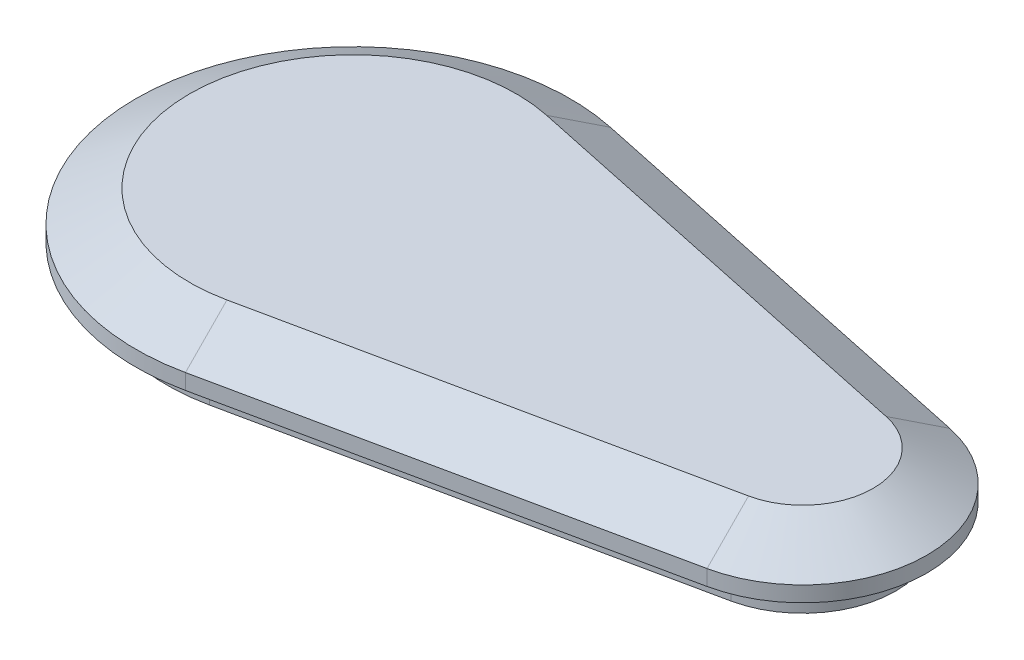
ISO-10303-21;
HEADER;
FILE_DESCRIPTION(('STEP AP214'),'2;1');
FILE_NAME('part.step','',(''),(''),'','','');
FILE_SCHEMA(('AUTOMOTIVE_DESIGN { 1 0 10303 214 1 1 1 1 }'));
ENDSEC;
DATA;
#1=APPLICATION_CONTEXT('core data for automotive mechanical design processes');
#2=APPLICATION_PROTOCOL_DEFINITION('international standard','automotive_design',2000,#1);
#3=PRODUCT_CONTEXT('',#1,'mechanical');
#4=PRODUCT('Part','Part','',(#3));
#5=PRODUCT_RELATED_PRODUCT_CATEGORY('part','',(#4));
#6=PRODUCT_DEFINITION_FORMATION('','',#4);
#7=PRODUCT_DEFINITION_CONTEXT('part definition',#1,'design');
#8=PRODUCT_DEFINITION('design','',#6,#7);
#9=PRODUCT_DEFINITION_SHAPE('','',#8);
#10=(LENGTH_UNIT() NAMED_UNIT(*) SI_UNIT(.MILLI.,.METRE.));
#11=(NAMED_UNIT(*) PLANE_ANGLE_UNIT() SI_UNIT($,.RADIAN.));
#12=(NAMED_UNIT(*) SI_UNIT($,.STERADIAN.) SOLID_ANGLE_UNIT());
#13=UNCERTAINTY_MEASURE_WITH_UNIT(LENGTH_MEASURE(1.E-05),#10,'distance_accuracy_value','');
#14=(GEOMETRIC_REPRESENTATION_CONTEXT(3) GLOBAL_UNCERTAINTY_ASSIGNED_CONTEXT((#13)) GLOBAL_UNIT_ASSIGNED_CONTEXT((#10,
#11,#12)) REPRESENTATION_CONTEXT('',''));
#15=CARTESIAN_POINT('',(0.,0.,0.));
#16=DIRECTION('',(0.,0.,1.));
#17=DIRECTION('',(1.,0.,0.));
#18=AXIS2_PLACEMENT_3D('',#15,#16,#17);
#19=CARTESIAN_POINT('',(0.,2.,0.));
#20=DIRECTION('',(0.,-1.,0.));
#21=DIRECTION('',(0.,0.,-1.));
#22=AXIS2_PLACEMENT_3D('',#19,#20,#21);
#23=CYLINDRICAL_SURFACE('',#22,12.);
#24=CARTESIAN_POINT('',(0.,0.,0.));
#25=DIRECTION('',(0.,1.,0.));
#26=DIRECTION('',(0.,0.,1.));
#27=AXIS2_PLACEMENT_3D('',#24,#25,#26);
#28=CIRCLE('',#27,12.);
#29=CARTESIAN_POINT('',(2.48275862068966,0.,-11.7403538971954));
#30=VERTEX_POINT('',#29);
#31=CARTESIAN_POINT('',(2.48275862068965,0.,11.7403538971954));
#32=VERTEX_POINT('',#31);
#33=EDGE_CURVE('E189',#30,#32,#28,.T.);
#34=ORIENTED_EDGE('',*,*,#33,.T.);
#35=DIRECTION('',(0.,-1.,0.));
#36=VECTOR('',#35,1.);
#37=CARTESIAN_POINT('',(2.48275862068965,2.,11.7403538971954));
#38=LINE('',#37,#36);
#39=CARTESIAN_POINT('',(2.48275862068965,2.,11.7403538971954));
#40=VERTEX_POINT('',#39);
#41=EDGE_CURVE('E11',#40,#32,#38,.T.);
#42=ORIENTED_EDGE('',*,*,#41,.F.);
#43=CARTESIAN_POINT('',(0.,2.,0.));
#44=DIRECTION('',(0.,1.,0.));
#45=DIRECTION('',(0.,0.,1.));
#46=AXIS2_PLACEMENT_3D('',#43,#44,#45);
#47=CIRCLE('',#46,12.);
#48=CARTESIAN_POINT('',(2.48275862068966,2.,-11.7403538971954));
#49=VERTEX_POINT('',#48);
#50=EDGE_CURVE('E190',#49,#40,#47,.T.);
#51=ORIENTED_EDGE('',*,*,#50,.F.);
#52=DIRECTION('',(0.,-1.,0.));
#53=VECTOR('',#52,1.);
#54=CARTESIAN_POINT('',(2.48275862068966,2.,-11.7403538971954));
#55=LINE('',#54,#53);
#56=EDGE_CURVE('E200',#49,#30,#55,.T.);
#57=ORIENTED_EDGE('',*,*,#56,.T.);
#58=EDGE_LOOP('',(#34,#42,#51,#57));
#59=FACE_BOUND('',#58,.T.);
#60=ADVANCED_FACE('F34',(#59),#23,.T.);
#61=CARTESIAN_POINT('',(2.48275862068965,2.,11.7403538971954));
#62=DIRECTION('',(-0.206896551724138,0.,-0.978362824766283));
#63=DIRECTION('',(-0.978362824766283,0.,0.206896551724138));
#64=AXIS2_PLACEMENT_3D('',#61,#62,#63);
#65=PLANE('',#64);
#66=DIRECTION('',(0.978362824766283,0.,-0.206896551724138));
#67=VECTOR('',#66,1.);
#68=CARTESIAN_POINT('',(2.48275862068965,0.,11.7403538971954));
#69=LINE('',#68,#67);
#70=CARTESIAN_POINT('',(30.2413793103448,0.,5.8701769485977));
#71=VERTEX_POINT('',#70);
#72=EDGE_CURVE('E203',#32,#71,#69,.T.);
#73=ORIENTED_EDGE('',*,*,#72,.T.);
#74=DIRECTION('',(0.,-1.,0.));
#75=VECTOR('',#74,1.);
#76=CARTESIAN_POINT('',(30.2413793103448,2.,5.8701769485977));
#77=LINE('',#76,#75);
#78=CARTESIAN_POINT('',(30.2413793103448,2.,5.8701769485977));
#79=VERTEX_POINT('',#78);
#80=EDGE_CURVE('E42',#79,#71,#77,.T.);
#81=ORIENTED_EDGE('',*,*,#80,.F.);
#82=DIRECTION('',(0.978362824766283,0.,-0.206896551724138));
#83=VECTOR('',#82,1.);
#84=CARTESIAN_POINT('',(2.48275862068965,2.,11.7403538971954));
#85=LINE('',#84,#83);
#86=EDGE_CURVE('E76',#40,#79,#85,.T.);
#87=ORIENTED_EDGE('',*,*,#86,.F.);
#88=ORIENTED_EDGE('',*,*,#41,.T.);
#89=EDGE_LOOP('',(#73,#81,#87,#88));
#90=FACE_BOUND('',#89,.T.);
#91=ADVANCED_FACE('F229',(#90),#65,.F.);
#92=CARTESIAN_POINT('',(29.,2.,0.));
#93=DIRECTION('',(0.,-1.,0.));
#94=DIRECTION('',(0.,0.,-1.));
#95=AXIS2_PLACEMENT_3D('',#92,#93,#94);
#96=CYLINDRICAL_SURFACE('',#95,6.);
#97=CARTESIAN_POINT('',(29.,0.,0.));
#98=DIRECTION('',(0.,1.,0.));
#99=DIRECTION('',(0.,0.,1.));
#100=AXIS2_PLACEMENT_3D('',#97,#98,#99);
#101=CIRCLE('',#100,6.);
#102=CARTESIAN_POINT('',(30.2413793103448,0.,-5.8701769485977));
#103=VERTEX_POINT('',#102);
#104=EDGE_CURVE('E66',#71,#103,#101,.T.);
#105=ORIENTED_EDGE('',*,*,#104,.T.);
#106=DIRECTION('',(0.,-1.,0.));
#107=VECTOR('',#106,1.);
#108=CARTESIAN_POINT('',(30.2413793103448,2.,-5.8701769485977));
#109=LINE('',#108,#107);
#110=CARTESIAN_POINT('',(30.2413793103448,2.,-5.8701769485977));
#111=VERTEX_POINT('',#110);
#112=EDGE_CURVE('E50',#111,#103,#109,.T.);
#113=ORIENTED_EDGE('',*,*,#112,.F.);
#114=CARTESIAN_POINT('',(29.,2.,0.));
#115=DIRECTION('',(0.,1.,0.));
#116=DIRECTION('',(0.,0.,1.));
#117=AXIS2_PLACEMENT_3D('',#114,#115,#116);
#118=CIRCLE('',#117,6.);
#119=EDGE_CURVE('E194',#79,#111,#118,.T.);
#120=ORIENTED_EDGE('',*,*,#119,.F.);
#121=ORIENTED_EDGE('',*,*,#80,.T.);
#122=EDGE_LOOP('',(#105,#113,#120,#121));
#123=FACE_BOUND('',#122,.T.);
#124=ADVANCED_FACE('F208',(#123),#96,.T.);
#125=CARTESIAN_POINT('',(2.48275862068966,2.,-11.7403538971954));
#126=DIRECTION('',(-0.206896551724138,0.,0.978362824766283));
#127=DIRECTION('',(0.978362824766283,0.,0.206896551724138));
#128=AXIS2_PLACEMENT_3D('',#125,#126,#127);
#129=PLANE('',#128);
#130=DIRECTION('',(-0.978362824766283,0.,-0.206896551724138));
#131=VECTOR('',#130,1.);
#132=CARTESIAN_POINT('',(2.48275862068966,0.,-11.7403538971954));
#133=LINE('',#132,#131);
#134=EDGE_CURVE('E71',#103,#30,#133,.T.);
#135=ORIENTED_EDGE('',*,*,#134,.T.);
#136=ORIENTED_EDGE('',*,*,#56,.F.);
#137=DIRECTION('',(-0.978362824766283,0.,-0.206896551724138));
#138=VECTOR('',#137,1.);
#139=CARTESIAN_POINT('',(2.48275862068966,2.,-11.7403538971954));
#140=LINE('',#139,#138);
#141=EDGE_CURVE('E197',#111,#49,#140,.T.);
#142=ORIENTED_EDGE('',*,*,#141,.F.);
#143=ORIENTED_EDGE('',*,*,#112,.T.);
#144=EDGE_LOOP('',(#135,#136,#142,#143));
#145=FACE_BOUND('',#144,.T.);
#146=ADVANCED_FACE('F213',(#145),#129,.F.);
#147=CARTESIAN_POINT('',(0.,0.,0.));
#148=DIRECTION('',(0.,1.,0.));
#149=DIRECTION('',(0.,0.,1.));
#150=AXIS2_PLACEMENT_3D('',#147,#148,#149);
#151=PLANE('',#150);
#152=ORIENTED_EDGE('',*,*,#33,.F.);
#153=ORIENTED_EDGE('',*,*,#134,.F.);
#154=ORIENTED_EDGE('',*,*,#104,.F.);
#155=ORIENTED_EDGE('',*,*,#72,.F.);
#156=EDGE_LOOP('',(#152,#153,#154,#155));
#157=FACE_BOUND('',#156,.T.);
#158=ADVANCED_FACE('F211',(#157),#151,.F.);
#159=CARTESIAN_POINT('',(29.,2.,0.));
#160=DIRECTION('',(0.,1.,0.));
#161=DIRECTION('',(0.,0.,1.));
#162=AXIS2_PLACEMENT_3D('',#159,#160,#161);
#163=PLANE('',#162);
#164=CARTESIAN_POINT('',(29.,2.,0.));
#165=DIRECTION('',(0.,1.,0.));
#166=DIRECTION('',(0.,0.,1.));
#167=AXIS2_PLACEMENT_3D('',#164,#165,#166);
#168=CIRCLE('',#167,8.);
#169=CARTESIAN_POINT('',(30.6551724137931,2.,7.82690259813027));
#170=VERTEX_POINT('',#169);
#171=CARTESIAN_POINT('',(30.6551724137931,2.,-7.82690259813027));
#172=VERTEX_POINT('',#171);
#173=EDGE_CURVE('E177',#170,#172,#168,.T.);
#174=ORIENTED_EDGE('',*,*,#173,.F.);
#175=DIRECTION('',(0.978362824766283,0.,-0.206896551724138));
#176=VECTOR('',#175,1.);
#177=CARTESIAN_POINT('',(2.89655172413793,2.,13.697079546728));
#178=LINE('',#177,#176);
#179=CARTESIAN_POINT('',(2.89655172413793,2.,13.697079546728));
#180=VERTEX_POINT('',#179);
#181=EDGE_CURVE('E133',#180,#170,#178,.T.);
#182=ORIENTED_EDGE('',*,*,#181,.F.);
#183=CARTESIAN_POINT('',(0.,2.,0.));
#184=DIRECTION('',(0.,1.,0.));
#185=DIRECTION('',(0.,0.,1.));
#186=AXIS2_PLACEMENT_3D('',#183,#184,#185);
#187=CIRCLE('',#186,14.);
#188=CARTESIAN_POINT('',(2.89655172413793,2.,-13.697079546728));
#189=VERTEX_POINT('',#188);
#190=EDGE_CURVE('E181',#189,#180,#187,.T.);
#191=ORIENTED_EDGE('',*,*,#190,.F.);
#192=DIRECTION('',(-0.978362824766283,0.,-0.206896551724138));
#193=VECTOR('',#192,1.);
#194=CARTESIAN_POINT('',(30.6551724137931,2.,-7.82690259813027));
#195=LINE('',#194,#193);
#196=EDGE_CURVE('E179',#172,#189,#195,.T.);
#197=ORIENTED_EDGE('',*,*,#196,.F.);
#198=EDGE_LOOP('',(#174,#182,#191,#197));
#199=FACE_BOUND('',#198,.T.);
#200=ORIENTED_EDGE('',*,*,#141,.T.);
#201=ORIENTED_EDGE('',*,*,#50,.T.);
#202=ORIENTED_EDGE('',*,*,#86,.T.);
#203=ORIENTED_EDGE('',*,*,#119,.T.);
#204=EDGE_LOOP('',(#200,#201,#202,#203));
#205=FACE_BOUND('',#204,.T.);
#206=ADVANCED_FACE('F215',(#199,#205),#163,.F.);
#207=CARTESIAN_POINT('',(29.,3.,0.));
#208=DIRECTION('',(0.,-1.,0.));
#209=DIRECTION('',(0.,0.,-1.));
#210=AXIS2_PLACEMENT_3D('',#207,#208,#209);
#211=CYLINDRICAL_SURFACE('',#210,8.);
#212=ORIENTED_EDGE('',*,*,#173,.T.);
#213=DIRECTION('',(0.,-1.,0.));
#214=VECTOR('',#213,1.);
#215=CARTESIAN_POINT('',(30.6551724137931,3.,-7.82690259813027));
#216=LINE('',#215,#214);
#217=CARTESIAN_POINT('',(30.6551724137931,3.,-7.82690259813027));
#218=VERTEX_POINT('',#217);
#219=EDGE_CURVE('E127',#218,#172,#216,.T.);
#220=ORIENTED_EDGE('',*,*,#219,.F.);
#221=CARTESIAN_POINT('',(29.,3.,0.));
#222=DIRECTION('',(0.,1.,0.));
#223=DIRECTION('',(0.,0.,1.));
#224=AXIS2_PLACEMENT_3D('',#221,#222,#223);
#225=CIRCLE('',#224,8.);
#226=CARTESIAN_POINT('',(30.6551724137931,3.,7.82690259813027));
#227=VERTEX_POINT('',#226);
#228=EDGE_CURVE('E120',#227,#218,#225,.T.);
#229=ORIENTED_EDGE('',*,*,#228,.F.);
#230=DIRECTION('',(0.,-1.,0.));
#231=VECTOR('',#230,1.);
#232=CARTESIAN_POINT('',(30.6551724137931,3.,7.82690259813027));
#233=LINE('',#232,#231);
#234=EDGE_CURVE('E124',#227,#170,#233,.T.);
#235=ORIENTED_EDGE('',*,*,#234,.T.);
#236=EDGE_LOOP('',(#212,#220,#229,#235));
#237=FACE_BOUND('',#236,.T.);
#238=ADVANCED_FACE('F123',(#237),#211,.T.);
#239=CARTESIAN_POINT('',(30.6551724137931,3.,-7.82690259813027));
#240=DIRECTION('',(-0.206896551724138,0.,0.978362824766283));
#241=DIRECTION('',(0.978362824766283,0.,0.206896551724138));
#242=AXIS2_PLACEMENT_3D('',#239,#240,#241);
#243=PLANE('',#242);
#244=ORIENTED_EDGE('',*,*,#196,.T.);
#245=DIRECTION('',(0.,-1.,0.));
#246=VECTOR('',#245,1.);
#247=CARTESIAN_POINT('',(2.89655172413793,3.,-13.697079546728));
#248=LINE('',#247,#246);
#249=CARTESIAN_POINT('',(2.89655172413793,3.,-13.697079546728));
#250=VERTEX_POINT('',#249);
#251=EDGE_CURVE('E185',#250,#189,#248,.T.);
#252=ORIENTED_EDGE('',*,*,#251,.F.);
#253=DIRECTION('',(-0.978362824766283,0.,-0.206896551724138));
#254=VECTOR('',#253,1.);
#255=CARTESIAN_POINT('',(30.6551724137931,3.,-7.82690259813027));
#256=LINE('',#255,#254);
#257=EDGE_CURVE('E132',#218,#250,#256,.T.);
#258=ORIENTED_EDGE('',*,*,#257,.F.);
#259=ORIENTED_EDGE('',*,*,#219,.T.);
#260=EDGE_LOOP('',(#244,#252,#258,#259));
#261=FACE_BOUND('',#260,.T.);
#262=ADVANCED_FACE('F223',(#261),#243,.F.);
#263=CARTESIAN_POINT('',(0.,3.,0.));
#264=DIRECTION('',(0.,-1.,0.));
#265=DIRECTION('',(0.,0.,-1.));
#266=AXIS2_PLACEMENT_3D('',#263,#264,#265);
#267=CYLINDRICAL_SURFACE('',#266,14.);
#268=ORIENTED_EDGE('',*,*,#190,.T.);
#269=DIRECTION('',(0.,-1.,0.));
#270=VECTOR('',#269,1.);
#271=CARTESIAN_POINT('',(2.89655172413793,3.,13.697079546728));
#272=LINE('',#271,#270);
#273=CARTESIAN_POINT('',(2.89655172413793,3.,13.697079546728));
#274=VERTEX_POINT('',#273);
#275=EDGE_CURVE('E143',#274,#180,#272,.T.);
#276=ORIENTED_EDGE('',*,*,#275,.F.);
#277=CARTESIAN_POINT('',(0.,3.,0.));
#278=DIRECTION('',(0.,1.,0.));
#279=DIRECTION('',(0.,0.,1.));
#280=AXIS2_PLACEMENT_3D('',#277,#278,#279);
#281=CIRCLE('',#280,14.);
#282=EDGE_CURVE('E154',#250,#274,#281,.T.);
#283=ORIENTED_EDGE('',*,*,#282,.F.);
#284=ORIENTED_EDGE('',*,*,#251,.T.);
#285=EDGE_LOOP('',(#268,#276,#283,#284));
#286=FACE_BOUND('',#285,.T.);
#287=ADVANCED_FACE('F242',(#286),#267,.T.);
#288=CARTESIAN_POINT('',(2.89655172413793,3.,13.697079546728));
#289=DIRECTION('',(-0.206896551724138,0.,-0.978362824766283));
#290=DIRECTION('',(-0.978362824766283,0.,0.206896551724138));
#291=AXIS2_PLACEMENT_3D('',#288,#289,#290);
#292=PLANE('',#291);
#293=ORIENTED_EDGE('',*,*,#181,.T.);
#294=ORIENTED_EDGE('',*,*,#234,.F.);
#295=DIRECTION('',(0.978362824766283,0.,-0.206896551724138));
#296=VECTOR('',#295,1.);
#297=CARTESIAN_POINT('',(2.89655172413793,3.,13.697079546728));
#298=LINE('',#297,#296);
#299=EDGE_CURVE('E140',#274,#227,#298,.T.);
#300=ORIENTED_EDGE('',*,*,#299,.F.);
#301=ORIENTED_EDGE('',*,*,#275,.T.);
#302=EDGE_LOOP('',(#293,#294,#300,#301));
#303=FACE_BOUND('',#302,.T.);
#304=ADVANCED_FACE('F138',(#303),#292,.F.);
#305=CARTESIAN_POINT('',(29.,3.,0.));
#306=DIRECTION('',(0.,-1.,0.));
#307=DIRECTION('',(0.,0.,1.));
#308=AXIS2_PLACEMENT_3D('',#305,#306,#307);
#309=CONICAL_SURFACE('',#308,8.,1.0471975511966);
#310=ORIENTED_EDGE('',*,*,#228,.T.);
#311=DIRECTION('',(0.179177669748505,-0.499999999999998,-0.847287060365906));
#312=VECTOR('',#311,1.);
#313=CARTESIAN_POINT('',(30.6551724137931,3.,-7.82690259813027));
#314=LINE('',#313,#312);
#315=CARTESIAN_POINT('',(29.9384617347991,5.,-4.43775435666663));
#316=VERTEX_POINT('',#315);
#317=EDGE_CURVE('E166',#316,#218,#314,.T.);
#318=ORIENTED_EDGE('',*,*,#317,.F.);
#319=CARTESIAN_POINT('',(29.,5.,0.));
#320=DIRECTION('',(0.,1.,0.));
#321=DIRECTION('',(0.,0.,1.));
#322=AXIS2_PLACEMENT_3D('',#319,#320,#321);
#323=CIRCLE('',#322,4.53589838486223);
#324=CARTESIAN_POINT('',(29.9384617347991,5.,4.43775435666663));
#325=VERTEX_POINT('',#324);
#326=EDGE_CURVE('E158',#325,#316,#323,.T.);
#327=ORIENTED_EDGE('',*,*,#326,.F.);
#328=DIRECTION('',(0.179177669748505,-0.499999999999998,0.847287060365906));
#329=VECTOR('',#328,1.);
#330=CARTESIAN_POINT('',(30.6551724137931,3.,7.82690259813027));
#331=LINE('',#330,#329);
#332=EDGE_CURVE('E150',#325,#227,#331,.T.);
#333=ORIENTED_EDGE('',*,*,#332,.T.);
#334=EDGE_LOOP('',(#310,#318,#327,#333));
#335=FACE_BOUND('',#334,.T.);
#336=ADVANCED_FACE('F156',(#335),#309,.T.);
#337=CARTESIAN_POINT('',(30.6551724137931,3.,-7.82690259813027));
#338=DIRECTION('',(0.103448275862069,0.86602540378444,-0.48918141238314));
#339=DIRECTION('',(0.,0.491820108607575,0.870696836315162));
#340=AXIS2_PLACEMENT_3D('',#337,#338,#339);
#341=PLANE('',#340);
#342=ORIENTED_EDGE('',*,*,#257,.T.);
#343=DIRECTION('',(0.179177669748504,-0.499999999999998,-0.847287060365906));
#344=VECTOR('',#343,1.);
#345=CARTESIAN_POINT('',(2.89655172413792,3.,-13.697079546728));
#346=LINE('',#345,#344);
#347=CARTESIAN_POINT('',(2.1798410451439,5.,-10.3079313052643));
#348=VERTEX_POINT('',#347);
#349=EDGE_CURVE('E161',#348,#250,#346,.T.);
#350=ORIENTED_EDGE('',*,*,#349,.F.);
#351=DIRECTION('',(0.978362824766283,0.,0.206896551724138));
#352=VECTOR('',#351,1.);
#353=CARTESIAN_POINT('',(29.9384617347991,5.,-4.43775435666663));
#354=LINE('',#353,#352);
#355=EDGE_CURVE('E171',#316,#348,#354,.F.);
#356=ORIENTED_EDGE('',*,*,#355,.F.);
#357=ORIENTED_EDGE('',*,*,#317,.T.);
#358=EDGE_LOOP('',(#342,#350,#356,#357));
#359=FACE_BOUND('',#358,.T.);
#360=ADVANCED_FACE('F250',(#359),#341,.T.);
#361=CARTESIAN_POINT('',(0.,3.,0.));
#362=DIRECTION('',(0.,-1.,0.));
#363=DIRECTION('',(0.,0.,1.));
#364=AXIS2_PLACEMENT_3D('',#361,#362,#363);
#365=CONICAL_SURFACE('',#364,14.,1.0471975511966);
#366=ORIENTED_EDGE('',*,*,#282,.T.);
#367=DIRECTION('',(0.179177669748505,-0.499999999999998,0.847287060365906));
#368=VECTOR('',#367,1.);
#369=CARTESIAN_POINT('',(2.89655172413793,3.,13.697079546728));
#370=LINE('',#369,#368);
#371=CARTESIAN_POINT('',(2.17984104514391,5.,10.3079313052643));
#372=VERTEX_POINT('',#371);
#373=EDGE_CURVE('E153',#372,#274,#370,.T.);
#374=ORIENTED_EDGE('',*,*,#373,.F.);
#375=CARTESIAN_POINT('',(0.,5.,0.));
#376=DIRECTION('',(0.,1.,0.));
#377=DIRECTION('',(0.,0.,1.));
#378=AXIS2_PLACEMENT_3D('',#375,#376,#377);
#379=CIRCLE('',#378,10.5358983848622);
#380=EDGE_CURVE('E163',#348,#372,#379,.T.);
#381=ORIENTED_EDGE('',*,*,#380,.F.);
#382=ORIENTED_EDGE('',*,*,#349,.T.);
#383=EDGE_LOOP('',(#366,#374,#381,#382));
#384=FACE_BOUND('',#383,.T.);
#385=ADVANCED_FACE('F255',(#384),#365,.T.);
#386=CARTESIAN_POINT('',(2.89655172413793,3.,13.697079546728));
#387=DIRECTION('',(0.103448275862069,0.86602540378444,0.48918141238314));
#388=DIRECTION('',(0.,-0.491820108607575,0.870696836315162));
#389=AXIS2_PLACEMENT_3D('',#386,#387,#388);
#390=PLANE('',#389);
#391=ORIENTED_EDGE('',*,*,#299,.T.);
#392=ORIENTED_EDGE('',*,*,#332,.F.);
#393=DIRECTION('',(-0.978362824766283,0.,0.206896551724138));
#394=VECTOR('',#393,1.);
#395=CARTESIAN_POINT('',(2.17984104514391,5.,10.3079313052643));
#396=LINE('',#395,#394);
#397=EDGE_CURVE('E159',#372,#325,#396,.F.);
#398=ORIENTED_EDGE('',*,*,#397,.F.);
#399=ORIENTED_EDGE('',*,*,#373,.T.);
#400=EDGE_LOOP('',(#391,#392,#398,#399));
#401=FACE_BOUND('',#400,.T.);
#402=ADVANCED_FACE('F148',(#401),#390,.T.);
#403=CARTESIAN_POINT('',(29.,5.,0.));
#404=DIRECTION('',(0.,1.,0.));
#405=DIRECTION('',(0.,0.,1.));
#406=AXIS2_PLACEMENT_3D('',#403,#404,#405);
#407=PLANE('',#406);
#408=ORIENTED_EDGE('',*,*,#326,.T.);
#409=ORIENTED_EDGE('',*,*,#355,.T.);
#410=ORIENTED_EDGE('',*,*,#380,.T.);
#411=ORIENTED_EDGE('',*,*,#397,.T.);
#412=EDGE_LOOP('',(#408,#409,#410,#411));
#413=FACE_BOUND('',#412,.T.);
#414=ADVANCED_FACE('F259',(#413),#407,.T.);
#415=CLOSED_SHELL('',(#60,#91,#124,#146,#158,#206,#238,#262,#287,#304,#336,#360,#385,#402,#414));
#416=MANIFOLD_SOLID_BREP('B2',#415);
#417=ADVANCED_BREP_SHAPE_REPRESENTATION('',(#18,#416),#14);
#418=SHAPE_DEFINITION_REPRESENTATION(#9,#417);
ENDSEC;
END-ISO-10303-21;
